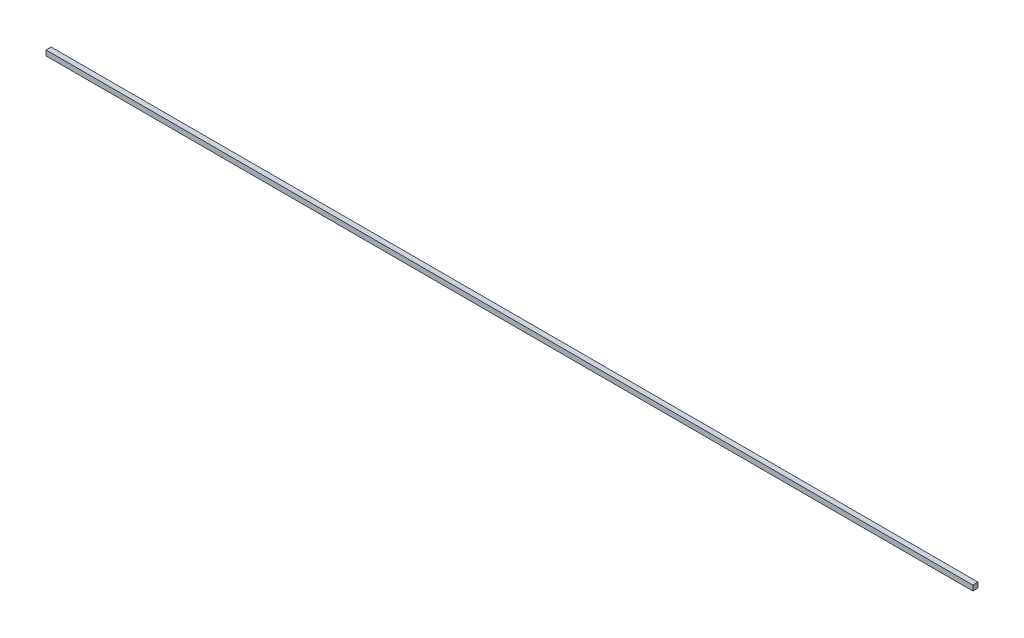
ISO-10303-21;
HEADER;
FILE_DESCRIPTION(('STEP AP214'),'2;1');
FILE_NAME('part.step','',(''),(''),'','','');
FILE_SCHEMA(('AUTOMOTIVE_DESIGN { 1 0 10303 214 1 1 1 1 }'));
ENDSEC;
DATA;
#1=APPLICATION_CONTEXT('core data for automotive mechanical design processes');
#2=APPLICATION_PROTOCOL_DEFINITION('international standard','automotive_design',2000,#1);
#3=PRODUCT_CONTEXT('',#1,'mechanical');
#4=PRODUCT('Part','Part','',(#3));
#5=PRODUCT_RELATED_PRODUCT_CATEGORY('part','',(#4));
#6=PRODUCT_DEFINITION_FORMATION('','',#4);
#7=PRODUCT_DEFINITION_CONTEXT('part definition',#1,'design');
#8=PRODUCT_DEFINITION('design','',#6,#7);
#9=PRODUCT_DEFINITION_SHAPE('','',#8);
#10=(LENGTH_UNIT() NAMED_UNIT(*) SI_UNIT(.MILLI.,.METRE.));
#11=(NAMED_UNIT(*) PLANE_ANGLE_UNIT() SI_UNIT($,.RADIAN.));
#12=(NAMED_UNIT(*) SI_UNIT($,.STERADIAN.) SOLID_ANGLE_UNIT());
#13=UNCERTAINTY_MEASURE_WITH_UNIT(LENGTH_MEASURE(1.E-05),#10,'distance_accuracy_value','');
#14=(GEOMETRIC_REPRESENTATION_CONTEXT(3) GLOBAL_UNCERTAINTY_ASSIGNED_CONTEXT((#13)) GLOBAL_UNIT_ASSIGNED_CONTEXT((#10,
#11,#12)) REPRESENTATION_CONTEXT('',''));
#15=CARTESIAN_POINT('',(0.,0.,0.));
#16=DIRECTION('',(0.,0.,1.));
#17=DIRECTION('',(1.,0.,0.));
#18=AXIS2_PLACEMENT_3D('',#15,#16,#17);
#19=CARTESIAN_POINT('',(900.,2.5,-2.5));
#20=DIRECTION('',(0.,0.,1.));
#21=DIRECTION('',(0.,1.,0.));
#22=AXIS2_PLACEMENT_3D('',#19,#20,#21);
#23=PLANE('',#22);
#24=DIRECTION('',(0.,-1.,0.));
#25=VECTOR('',#24,1.);
#26=CARTESIAN_POINT('',(0.,2.5,-2.5));
#27=LINE('',#26,#25);
#28=CARTESIAN_POINT('',(0.,2.5,-2.5));
#29=VERTEX_POINT('',#28);
#30=CARTESIAN_POINT('',(0.,-2.5,-2.5));
#31=VERTEX_POINT('',#30);
#32=EDGE_CURVE('E104',#29,#31,#27,.T.);
#33=ORIENTED_EDGE('',*,*,#32,.F.);
#34=DIRECTION('',(-1.,0.,0.));
#35=VECTOR('',#34,1.);
#36=CARTESIAN_POINT('',(900.,2.5,-2.5));
#37=LINE('',#36,#35);
#38=CARTESIAN_POINT('',(900.,2.5,-2.5));
#39=VERTEX_POINT('',#38);
#40=EDGE_CURVE('E103',#39,#29,#37,.T.);
#41=ORIENTED_EDGE('',*,*,#40,.F.);
#42=DIRECTION('',(0.,-1.,0.));
#43=VECTOR('',#42,1.);
#44=CARTESIAN_POINT('',(900.,2.5,-2.5));
#45=LINE('',#44,#43);
#46=CARTESIAN_POINT('',(900.,-2.5,-2.5));
#47=VERTEX_POINT('',#46);
#48=EDGE_CURVE('E98',#39,#47,#45,.T.);
#49=ORIENTED_EDGE('',*,*,#48,.T.);
#50=DIRECTION('',(-1.,0.,0.));
#51=VECTOR('',#50,1.);
#52=CARTESIAN_POINT('',(900.,-2.5,-2.5));
#53=LINE('',#52,#51);
#54=EDGE_CURVE('E11',#47,#31,#53,.T.);
#55=ORIENTED_EDGE('',*,*,#54,.T.);
#56=EDGE_LOOP('',(#33,#41,#49,#55));
#57=FACE_BOUND('',#56,.T.);
#58=ADVANCED_FACE('F41',(#57),#23,.F.);
#59=CARTESIAN_POINT('',(900.,-2.5,2.5));
#60=DIRECTION('',(0.,1.,0.));
#61=DIRECTION('',(0.,0.,-1.));
#62=AXIS2_PLACEMENT_3D('',#59,#60,#61);
#63=PLANE('',#62);
#64=DIRECTION('',(0.,0.,1.));
#65=VECTOR('',#64,1.);
#66=CARTESIAN_POINT('',(0.,-2.5,2.5));
#67=LINE('',#66,#65);
#68=CARTESIAN_POINT('',(0.,-2.5,2.5));
#69=VERTEX_POINT('',#68);
#70=EDGE_CURVE('E106',#31,#69,#67,.T.);
#71=ORIENTED_EDGE('',*,*,#70,.F.);
#72=ORIENTED_EDGE('',*,*,#54,.F.);
#73=DIRECTION('',(0.,0.,1.));
#74=VECTOR('',#73,1.);
#75=CARTESIAN_POINT('',(900.,-2.5,2.5));
#76=LINE('',#75,#74);
#77=CARTESIAN_POINT('',(900.,-2.5,2.5));
#78=VERTEX_POINT('',#77);
#79=EDGE_CURVE('E82',#47,#78,#76,.T.);
#80=ORIENTED_EDGE('',*,*,#79,.T.);
#81=DIRECTION('',(-1.,0.,0.));
#82=VECTOR('',#81,1.);
#83=CARTESIAN_POINT('',(900.,-2.5,2.5));
#84=LINE('',#83,#82);
#85=EDGE_CURVE('E49',#78,#69,#84,.T.);
#86=ORIENTED_EDGE('',*,*,#85,.T.);
#87=EDGE_LOOP('',(#71,#72,#80,#86));
#88=FACE_BOUND('',#87,.T.);
#89=ADVANCED_FACE('F96',(#88),#63,.F.);
#90=CARTESIAN_POINT('',(900.,2.5,2.5));
#91=DIRECTION('',(0.,0.,-1.));
#92=DIRECTION('',(0.,-1.,0.));
#93=AXIS2_PLACEMENT_3D('',#90,#91,#92);
#94=PLANE('',#93);
#95=DIRECTION('',(0.,1.,0.));
#96=VECTOR('',#95,1.);
#97=CARTESIAN_POINT('',(0.,2.5,2.5));
#98=LINE('',#97,#96);
#99=CARTESIAN_POINT('',(0.,2.5,2.5));
#100=VERTEX_POINT('',#99);
#101=EDGE_CURVE('E92',#69,#100,#98,.T.);
#102=ORIENTED_EDGE('',*,*,#101,.F.);
#103=ORIENTED_EDGE('',*,*,#85,.F.);
#104=DIRECTION('',(0.,1.,0.));
#105=VECTOR('',#104,1.);
#106=CARTESIAN_POINT('',(900.,2.5,2.5));
#107=LINE('',#106,#105);
#108=CARTESIAN_POINT('',(900.,2.5,2.5));
#109=VERTEX_POINT('',#108);
#110=EDGE_CURVE('E85',#78,#109,#107,.T.);
#111=ORIENTED_EDGE('',*,*,#110,.T.);
#112=DIRECTION('',(-1.,0.,0.));
#113=VECTOR('',#112,1.);
#114=CARTESIAN_POINT('',(900.,2.5,2.5));
#115=LINE('',#114,#113);
#116=EDGE_CURVE('E95',#109,#100,#115,.T.);
#117=ORIENTED_EDGE('',*,*,#116,.T.);
#118=EDGE_LOOP('',(#102,#103,#111,#117));
#119=FACE_BOUND('',#118,.T.);
#120=ADVANCED_FACE('F91',(#119),#94,.F.);
#121=CARTESIAN_POINT('',(900.,2.5,2.5));
#122=DIRECTION('',(0.,-1.,0.));
#123=DIRECTION('',(0.,0.,1.));
#124=AXIS2_PLACEMENT_3D('',#121,#122,#123);
#125=PLANE('',#124);
#126=DIRECTION('',(0.,0.,-1.));
#127=VECTOR('',#126,1.);
#128=CARTESIAN_POINT('',(0.,2.5,2.5));
#129=LINE('',#128,#127);
#130=EDGE_CURVE('E71',#100,#29,#129,.T.);
#131=ORIENTED_EDGE('',*,*,#130,.F.);
#132=ORIENTED_EDGE('',*,*,#116,.F.);
#133=DIRECTION('',(0.,0.,-1.));
#134=VECTOR('',#133,1.);
#135=CARTESIAN_POINT('',(900.,2.5,2.5));
#136=LINE('',#135,#134);
#137=EDGE_CURVE('E57',#109,#39,#136,.T.);
#138=ORIENTED_EDGE('',*,*,#137,.T.);
#139=ORIENTED_EDGE('',*,*,#40,.T.);
#140=EDGE_LOOP('',(#131,#132,#138,#139));
#141=FACE_BOUND('',#140,.T.);
#142=ADVANCED_FACE('F115',(#141),#125,.F.);
#143=CARTESIAN_POINT('',(900.,0.,0.));
#144=DIRECTION('',(-1.,0.,0.));
#145=DIRECTION('',(0.,0.,-1.));
#146=AXIS2_PLACEMENT_3D('',#143,#144,#145);
#147=PLANE('',#146);
#148=ORIENTED_EDGE('',*,*,#48,.F.);
#149=ORIENTED_EDGE('',*,*,#137,.F.);
#150=ORIENTED_EDGE('',*,*,#110,.F.);
#151=ORIENTED_EDGE('',*,*,#79,.F.);
#152=EDGE_LOOP('',(#148,#149,#150,#151));
#153=FACE_BOUND('',#152,.T.);
#154=ADVANCED_FACE('F87',(#153),#147,.F.);
#155=CARTESIAN_POINT('',(0.,0.,0.));
#156=DIRECTION('',(-1.,0.,0.));
#157=DIRECTION('',(0.,0.,-1.));
#158=AXIS2_PLACEMENT_3D('',#155,#156,#157);
#159=PLANE('',#158);
#160=ORIENTED_EDGE('',*,*,#32,.T.);
#161=ORIENTED_EDGE('',*,*,#70,.T.);
#162=ORIENTED_EDGE('',*,*,#101,.T.);
#163=ORIENTED_EDGE('',*,*,#130,.T.);
#164=EDGE_LOOP('',(#160,#161,#162,#163));
#165=FACE_BOUND('',#164,.T.);
#166=ADVANCED_FACE('F111',(#165),#159,.T.);
#167=CLOSED_SHELL('',(#58,#89,#120,#142,#154,#166));
#168=MANIFOLD_SOLID_BREP('B2',#167);
#169=ADVANCED_BREP_SHAPE_REPRESENTATION('',(#18,#168),#14);
#170=SHAPE_DEFINITION_REPRESENTATION(#9,#169);
ENDSEC;
END-ISO-10303-21;
